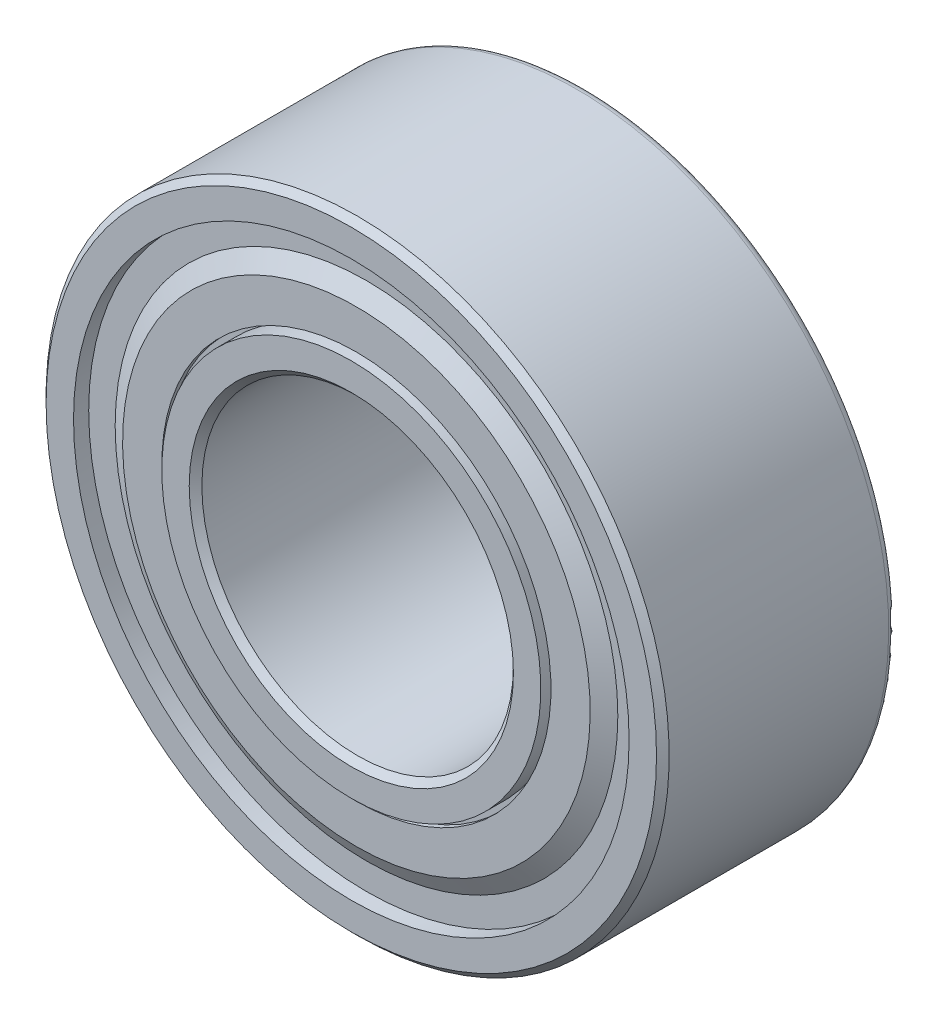
ISO-10303-21;
HEADER;
FILE_DESCRIPTION(('STEP AP214'),'2;1');
FILE_NAME('part.step','',(''),(''),'','','');
FILE_SCHEMA(('AUTOMOTIVE_DESIGN { 1 0 10303 214 1 1 1 1 }'));
ENDSEC;
DATA;
#1=APPLICATION_CONTEXT('core data for automotive mechanical design processes');
#2=APPLICATION_PROTOCOL_DEFINITION('international standard','automotive_design',2000,#1);
#3=PRODUCT_CONTEXT('',#1,'mechanical');
#4=PRODUCT('Part','Part','',(#3));
#5=PRODUCT_RELATED_PRODUCT_CATEGORY('part','',(#4));
#6=PRODUCT_DEFINITION_FORMATION('','',#4);
#7=PRODUCT_DEFINITION_CONTEXT('part definition',#1,'design');
#8=PRODUCT_DEFINITION('design','',#6,#7);
#9=PRODUCT_DEFINITION_SHAPE('','',#8);
#10=(LENGTH_UNIT() NAMED_UNIT(*) SI_UNIT(.MILLI.,.METRE.));
#11=(NAMED_UNIT(*) PLANE_ANGLE_UNIT() SI_UNIT($,.RADIAN.));
#12=(NAMED_UNIT(*) SI_UNIT($,.STERADIAN.) SOLID_ANGLE_UNIT());
#13=UNCERTAINTY_MEASURE_WITH_UNIT(LENGTH_MEASURE(1.E-05),#10,'distance_accuracy_value','');
#14=(GEOMETRIC_REPRESENTATION_CONTEXT(3) GLOBAL_UNCERTAINTY_ASSIGNED_CONTEXT((#13)) GLOBAL_UNIT_ASSIGNED_CONTEXT((#10,
#11,#12)) REPRESENTATION_CONTEXT('',''));
#15=CARTESIAN_POINT('',(0.,0.,0.));
#16=DIRECTION('',(0.,0.,1.));
#17=DIRECTION('',(1.,0.,0.));
#18=AXIS2_PLACEMENT_3D('',#15,#16,#17);
#19=CARTESIAN_POINT('',(0.,0.,0.));
#20=DIRECTION('',(0.,0.,1.));
#21=DIRECTION('',(0.,-1.,0.));
#22=AXIS2_PLACEMENT_3D('',#19,#20,#21);
#23=CYLINDRICAL_SURFACE('',#22,3.56666666666667);
#24=CARTESIAN_POINT('',(0.,0.,-1.24));
#25=DIRECTION('',(0.,0.,1.));
#26=DIRECTION('',(0.,-1.,0.));
#27=AXIS2_PLACEMENT_3D('',#24,#25,#26);
#28=CIRCLE('',#27,3.56666666666667);
#29=CARTESIAN_POINT('',(0.,-3.56666666666667,-1.24));
#30=VERTEX_POINT('',#29);
#31=EDGE_CURVE('E83',#30,#30,#28,.T.);
#32=ORIENTED_EDGE('',*,*,#31,.F.);
#33=EDGE_LOOP('',(#32));
#34=FACE_BOUND('',#33,.T.);
#35=CARTESIAN_POINT('',(0.,0.,-1.305));
#36=DIRECTION('',(0.,0.,1.));
#37=DIRECTION('',(0.,-1.,0.));
#38=AXIS2_PLACEMENT_3D('',#35,#36,#37);
#39=CIRCLE('',#38,3.56666666666667);
#40=CARTESIAN_POINT('',(0.,-3.56666666666667,-1.305));
#41=VERTEX_POINT('',#40);
#42=EDGE_CURVE('E12',#41,#41,#39,.T.);
#43=ORIENTED_EDGE('',*,*,#42,.T.);
#44=EDGE_LOOP('',(#43));
#45=FACE_BOUND('',#44,.T.);
#46=ADVANCED_FACE('F55',(#34,#45),#23,.T.);
#47=CARTESIAN_POINT('',(0.,3.56666666666667,-1.305));
#48=DIRECTION('',(0.,0.,1.));
#49=DIRECTION('',(0.,-1.,0.));
#50=AXIS2_PLACEMENT_3D('',#47,#48,#49);
#51=PLANE('',#50);
#52=ORIENTED_EDGE('',*,*,#42,.F.);
#53=EDGE_LOOP('',(#52));
#54=FACE_BOUND('',#53,.T.);
#55=CARTESIAN_POINT('',(0.,0.,-1.305));
#56=DIRECTION('',(0.,0.,1.));
#57=DIRECTION('',(0.,-1.,0.));
#58=AXIS2_PLACEMENT_3D('',#55,#56,#57);
#59=CIRCLE('',#58,3.22694050703183);
#60=CARTESIAN_POINT('',(0.,-3.22694050703183,-1.305));
#61=VERTEX_POINT('',#60);
#62=EDGE_CURVE('E61',#61,#61,#59,.T.);
#63=ORIENTED_EDGE('',*,*,#62,.T.);
#64=EDGE_LOOP('',(#63));
#65=FACE_BOUND('',#64,.T.);
#66=ADVANCED_FACE('F90',(#54,#65),#51,.F.);
#67=CARTESIAN_POINT('',(0.,0.,-1.435));
#68=DIRECTION('',(0.,0.,1.));
#69=DIRECTION('',(0.,-1.,0.));
#70=AXIS2_PLACEMENT_3D('',#67,#68,#69);
#71=CONICAL_SURFACE('',#70,3.00177390204788,1.0471975511966);
#72=ORIENTED_EDGE('',*,*,#62,.F.);
#73=EDGE_LOOP('',(#72));
#74=FACE_BOUND('',#73,.T.);
#75=CARTESIAN_POINT('',(0.,0.,-1.435));
#76=DIRECTION('',(0.,0.,1.));
#77=DIRECTION('',(0.,-1.,0.));
#78=AXIS2_PLACEMENT_3D('',#75,#76,#77);
#79=CIRCLE('',#78,3.00177390204788);
#80=CARTESIAN_POINT('',(0.,-3.00177390204788,-1.435));
#81=VERTEX_POINT('',#80);
#82=EDGE_CURVE('E65',#81,#81,#79,.T.);
#83=ORIENTED_EDGE('',*,*,#82,.T.);
#84=EDGE_LOOP('',(#83));
#85=FACE_BOUND('',#84,.T.);
#86=ADVANCED_FACE('F94',(#74,#85),#71,.T.);
#87=CARTESIAN_POINT('',(0.,3.00177390204788,-1.435));
#88=DIRECTION('',(0.,0.,1.));
#89=DIRECTION('',(0.,-1.,0.));
#90=AXIS2_PLACEMENT_3D('',#87,#88,#89);
#91=PLANE('',#90);
#92=ORIENTED_EDGE('',*,*,#82,.F.);
#93=EDGE_LOOP('',(#92));
#94=FACE_BOUND('',#93,.T.);
#95=CARTESIAN_POINT('',(0.,0.,-1.435));
#96=DIRECTION('',(0.,0.,1.));
#97=DIRECTION('',(0.,-1.,0.));
#98=AXIS2_PLACEMENT_3D('',#95,#96,#97);
#99=CIRCLE('',#98,2.49833333333333);
#100=CARTESIAN_POINT('',(0.,-2.49833333333333,-1.435));
#101=VERTEX_POINT('',#100);
#102=EDGE_CURVE('E69',#101,#101,#99,.T.);
#103=ORIENTED_EDGE('',*,*,#102,.T.);
#104=EDGE_LOOP('',(#103));
#105=FACE_BOUND('',#104,.T.);
#106=ADVANCED_FACE('F99',(#94,#105),#91,.F.);
#107=CARTESIAN_POINT('',(0.,0.,0.));
#108=DIRECTION('',(0.,0.,1.));
#109=DIRECTION('',(0.,-1.,0.));
#110=AXIS2_PLACEMENT_3D('',#107,#108,#109);
#111=CYLINDRICAL_SURFACE('',#110,2.49833333333333);
#112=ORIENTED_EDGE('',*,*,#102,.F.);
#113=EDGE_LOOP('',(#112));
#114=FACE_BOUND('',#113,.T.);
#115=CARTESIAN_POINT('',(0.,0.,-1.37));
#116=DIRECTION('',(0.,0.,1.));
#117=DIRECTION('',(0.,-1.,0.));
#118=AXIS2_PLACEMENT_3D('',#115,#116,#117);
#119=CIRCLE('',#118,2.49833333333333);
#120=CARTESIAN_POINT('',(0.,-2.49833333333333,-1.37));
#121=VERTEX_POINT('',#120);
#122=EDGE_CURVE('E74',#121,#121,#119,.T.);
#123=ORIENTED_EDGE('',*,*,#122,.T.);
#124=EDGE_LOOP('',(#123));
#125=FACE_BOUND('',#124,.T.);
#126=ADVANCED_FACE('F105',(#114,#125),#111,.F.);
#127=CARTESIAN_POINT('',(0.,2.98435720453986,-1.37));
#128=DIRECTION('',(0.,0.,-1.));
#129=DIRECTION('',(0.,1.,0.));
#130=AXIS2_PLACEMENT_3D('',#127,#128,#129);
#131=PLANE('',#130);
#132=ORIENTED_EDGE('',*,*,#122,.F.);
#133=EDGE_LOOP('',(#132));
#134=FACE_BOUND('',#133,.T.);
#135=CARTESIAN_POINT('',(0.,0.,-1.37));
#136=DIRECTION('',(0.,0.,1.));
#137=DIRECTION('',(0.,-1.,0.));
#138=AXIS2_PLACEMENT_3D('',#135,#136,#137);
#139=CIRCLE('',#138,2.98435720453986);
#140=CARTESIAN_POINT('',(0.,-2.98435720453986,-1.37));
#141=VERTEX_POINT('',#140);
#142=EDGE_CURVE('E77',#141,#141,#139,.T.);
#143=ORIENTED_EDGE('',*,*,#142,.T.);
#144=EDGE_LOOP('',(#143));
#145=FACE_BOUND('',#144,.T.);
#146=ADVANCED_FACE('F109',(#134,#145),#131,.F.);
#147=CARTESIAN_POINT('',(0.,0.,-1.24));
#148=DIRECTION('',(0.,0.,1.));
#149=DIRECTION('',(0.,-1.,0.));
#150=AXIS2_PLACEMENT_3D('',#147,#148,#149);
#151=CONICAL_SURFACE('',#150,3.20952380952381,1.0471975511966);
#152=ORIENTED_EDGE('',*,*,#142,.F.);
#153=EDGE_LOOP('',(#152));
#154=FACE_BOUND('',#153,.T.);
#155=CARTESIAN_POINT('',(0.,0.,-1.24));
#156=DIRECTION('',(0.,0.,1.));
#157=DIRECTION('',(0.,-1.,0.));
#158=AXIS2_PLACEMENT_3D('',#155,#156,#157);
#159=CIRCLE('',#158,3.20952380952381);
#160=CARTESIAN_POINT('',(0.,-3.20952380952381,-1.24));
#161=VERTEX_POINT('',#160);
#162=EDGE_CURVE('E80',#161,#161,#159,.T.);
#163=ORIENTED_EDGE('',*,*,#162,.T.);
#164=EDGE_LOOP('',(#163));
#165=FACE_BOUND('',#164,.T.);
#166=ADVANCED_FACE('F113',(#154,#165),#151,.F.);
#167=CARTESIAN_POINT('',(0.,3.56666666666667,-1.24));
#168=DIRECTION('',(0.,0.,-1.));
#169=DIRECTION('',(0.,1.,0.));
#170=AXIS2_PLACEMENT_3D('',#167,#168,#169);
#171=PLANE('',#170);
#172=ORIENTED_EDGE('',*,*,#162,.F.);
#173=EDGE_LOOP('',(#172));
#174=FACE_BOUND('',#173,.T.);
#175=ORIENTED_EDGE('',*,*,#31,.T.);
#176=EDGE_LOOP('',(#175));
#177=FACE_BOUND('',#176,.T.);
#178=ADVANCED_FACE('F87',(#174,#177),#171,.F.);
#179=CLOSED_SHELL('',(#46,#66,#86,#106,#126,#146,#166,#178));
#180=MANIFOLD_SOLID_BREP('B2',#179);
#181=CARTESIAN_POINT('',(0.,0.,0.));
#182=DIRECTION('',(0.,0.,1.));
#183=DIRECTION('',(0.,-1.,0.));
#184=AXIS2_PLACEMENT_3D('',#181,#182,#183);
#185=CYLINDRICAL_SURFACE('',#184,3.56666666666667);
#186=CARTESIAN_POINT('',(0.,0.,1.305));
#187=DIRECTION('',(0.,0.,1.));
#188=DIRECTION('',(0.,-1.,0.));
#189=AXIS2_PLACEMENT_3D('',#186,#187,#188);
#190=CIRCLE('',#189,3.56666666666667);
#191=CARTESIAN_POINT('',(0.,-3.56666666666667,1.305));
#192=VERTEX_POINT('',#191);
#193=EDGE_CURVE('E54',#192,#192,#190,.T.);
#194=ORIENTED_EDGE('',*,*,#193,.F.);
#195=EDGE_LOOP('',(#194));
#196=FACE_BOUND('',#195,.T.);
#197=CARTESIAN_POINT('',(0.,0.,1.24));
#198=DIRECTION('',(0.,0.,1.));
#199=DIRECTION('',(0.,-1.,0.));
#200=AXIS2_PLACEMENT_3D('',#197,#198,#199);
#201=CIRCLE('',#200,3.56666666666667);
#202=CARTESIAN_POINT('',(0.,-3.56666666666667,1.24));
#203=VERTEX_POINT('',#202);
#204=EDGE_CURVE('E210',#203,#203,#201,.T.);
#205=ORIENTED_EDGE('',*,*,#204,.T.);
#206=EDGE_LOOP('',(#205));
#207=FACE_BOUND('',#206,.T.);
#208=ADVANCED_FACE('F182',(#196,#207),#185,.T.);
#209=CARTESIAN_POINT('',(0.,3.56666666666667,1.305));
#210=DIRECTION('',(0.,0.,-1.));
#211=DIRECTION('',(0.,1.,0.));
#212=AXIS2_PLACEMENT_3D('',#209,#210,#211);
#213=PLANE('',#212);
#214=CARTESIAN_POINT('',(0.,0.,1.305));
#215=DIRECTION('',(0.,0.,1.));
#216=DIRECTION('',(0.,-1.,0.));
#217=AXIS2_PLACEMENT_3D('',#214,#215,#216);
#218=CIRCLE('',#217,3.22694050703183);
#219=CARTESIAN_POINT('',(0.,-3.22694050703183,1.305));
#220=VERTEX_POINT('',#219);
#221=EDGE_CURVE('E188',#220,#220,#218,.T.);
#222=ORIENTED_EDGE('',*,*,#221,.F.);
#223=EDGE_LOOP('',(#222));
#224=FACE_BOUND('',#223,.T.);
#225=ORIENTED_EDGE('',*,*,#193,.T.);
#226=EDGE_LOOP('',(#225));
#227=FACE_BOUND('',#226,.T.);
#228=ADVANCED_FACE('F247',(#224,#227),#213,.F.);
#229=CARTESIAN_POINT('',(0.,0.,1.305));
#230=DIRECTION('',(0.,0.,-1.));
#231=DIRECTION('',(0.,1.,0.));
#232=AXIS2_PLACEMENT_3D('',#229,#230,#231);
#233=CONICAL_SURFACE('',#232,3.22694050703183,1.0471975511966);
#234=CARTESIAN_POINT('',(0.,0.,1.435));
#235=DIRECTION('',(0.,0.,1.));
#236=DIRECTION('',(0.,-1.,0.));
#237=AXIS2_PLACEMENT_3D('',#234,#235,#236);
#238=CIRCLE('',#237,3.00177390204788);
#239=CARTESIAN_POINT('',(0.,-3.00177390204788,1.435));
#240=VERTEX_POINT('',#239);
#241=EDGE_CURVE('E192',#240,#240,#238,.T.);
#242=ORIENTED_EDGE('',*,*,#241,.F.);
#243=EDGE_LOOP('',(#242));
#244=FACE_BOUND('',#243,.T.);
#245=ORIENTED_EDGE('',*,*,#221,.T.);
#246=EDGE_LOOP('',(#245));
#247=FACE_BOUND('',#246,.T.);
#248=ADVANCED_FACE('F242',(#244,#247),#233,.T.);
#249=CARTESIAN_POINT('',(0.,3.00177390204788,1.435));
#250=DIRECTION('',(0.,0.,-1.));
#251=DIRECTION('',(0.,1.,0.));
#252=AXIS2_PLACEMENT_3D('',#249,#250,#251);
#253=PLANE('',#252);
#254=CARTESIAN_POINT('',(0.,0.,1.435));
#255=DIRECTION('',(0.,0.,1.));
#256=DIRECTION('',(0.,-1.,0.));
#257=AXIS2_PLACEMENT_3D('',#254,#255,#256);
#258=CIRCLE('',#257,2.49833333333333);
#259=CARTESIAN_POINT('',(0.,-2.49833333333333,1.435));
#260=VERTEX_POINT('',#259);
#261=EDGE_CURVE('E196',#260,#260,#258,.T.);
#262=ORIENTED_EDGE('',*,*,#261,.F.);
#263=EDGE_LOOP('',(#262));
#264=FACE_BOUND('',#263,.T.);
#265=ORIENTED_EDGE('',*,*,#241,.T.);
#266=EDGE_LOOP('',(#265));
#267=FACE_BOUND('',#266,.T.);
#268=ADVANCED_FACE('F236',(#264,#267),#253,.F.);
#269=CARTESIAN_POINT('',(0.,0.,0.));
#270=DIRECTION('',(0.,0.,1.));
#271=DIRECTION('',(0.,-1.,0.));
#272=AXIS2_PLACEMENT_3D('',#269,#270,#271);
#273=CYLINDRICAL_SURFACE('',#272,2.49833333333333);
#274=CARTESIAN_POINT('',(0.,0.,1.37));
#275=DIRECTION('',(0.,0.,1.));
#276=DIRECTION('',(0.,-1.,0.));
#277=AXIS2_PLACEMENT_3D('',#274,#275,#276);
#278=CIRCLE('',#277,2.49833333333333);
#279=CARTESIAN_POINT('',(0.,-2.49833333333333,1.37));
#280=VERTEX_POINT('',#279);
#281=EDGE_CURVE('E201',#280,#280,#278,.T.);
#282=ORIENTED_EDGE('',*,*,#281,.F.);
#283=EDGE_LOOP('',(#282));
#284=FACE_BOUND('',#283,.T.);
#285=ORIENTED_EDGE('',*,*,#261,.T.);
#286=EDGE_LOOP('',(#285));
#287=FACE_BOUND('',#286,.T.);
#288=ADVANCED_FACE('F230',(#284,#287),#273,.F.);
#289=CARTESIAN_POINT('',(0.,2.98435720453986,1.37));
#290=DIRECTION('',(0.,0.,1.));
#291=DIRECTION('',(0.,-1.,0.));
#292=AXIS2_PLACEMENT_3D('',#289,#290,#291);
#293=PLANE('',#292);
#294=CARTESIAN_POINT('',(0.,0.,1.37));
#295=DIRECTION('',(0.,0.,1.));
#296=DIRECTION('',(0.,-1.,0.));
#297=AXIS2_PLACEMENT_3D('',#294,#295,#296);
#298=CIRCLE('',#297,2.98435720453986);
#299=CARTESIAN_POINT('',(0.,-2.98435720453986,1.37));
#300=VERTEX_POINT('',#299);
#301=EDGE_CURVE('E204',#300,#300,#298,.T.);
#302=ORIENTED_EDGE('',*,*,#301,.F.);
#303=EDGE_LOOP('',(#302));
#304=FACE_BOUND('',#303,.T.);
#305=ORIENTED_EDGE('',*,*,#281,.T.);
#306=EDGE_LOOP('',(#305));
#307=FACE_BOUND('',#306,.T.);
#308=ADVANCED_FACE('F224',(#304,#307),#293,.F.);
#309=CARTESIAN_POINT('',(0.,0.,1.37));
#310=DIRECTION('',(0.,0.,-1.));
#311=DIRECTION('',(0.,1.,0.));
#312=AXIS2_PLACEMENT_3D('',#309,#310,#311);
#313=CONICAL_SURFACE('',#312,2.98435720453986,1.0471975511966);
#314=CARTESIAN_POINT('',(0.,0.,1.24));
#315=DIRECTION('',(0.,0.,1.));
#316=DIRECTION('',(0.,-1.,0.));
#317=AXIS2_PLACEMENT_3D('',#314,#315,#316);
#318=CIRCLE('',#317,3.20952380952381);
#319=CARTESIAN_POINT('',(0.,-3.20952380952381,1.24));
#320=VERTEX_POINT('',#319);
#321=EDGE_CURVE('E207',#320,#320,#318,.T.);
#322=ORIENTED_EDGE('',*,*,#321,.F.);
#323=EDGE_LOOP('',(#322));
#324=FACE_BOUND('',#323,.T.);
#325=ORIENTED_EDGE('',*,*,#301,.T.);
#326=EDGE_LOOP('',(#325));
#327=FACE_BOUND('',#326,.T.);
#328=ADVANCED_FACE('F218',(#324,#327),#313,.F.);
#329=CARTESIAN_POINT('',(0.,3.56666666666667,1.24));
#330=DIRECTION('',(0.,0.,1.));
#331=DIRECTION('',(0.,-1.,0.));
#332=AXIS2_PLACEMENT_3D('',#329,#330,#331);
#333=PLANE('',#332);
#334=ORIENTED_EDGE('',*,*,#204,.F.);
#335=EDGE_LOOP('',(#334));
#336=FACE_BOUND('',#335,.T.);
#337=ORIENTED_EDGE('',*,*,#321,.T.);
#338=EDGE_LOOP('',(#337));
#339=FACE_BOUND('',#338,.T.);
#340=ADVANCED_FACE('F215',(#336,#339),#333,.F.);
#341=CLOSED_SHELL('',(#208,#228,#248,#268,#288,#308,#328,#340));
#342=MANIFOLD_SOLID_BREP('B7',#341);
#343=CARTESIAN_POINT('',(-1.49999999999997,2.59807621135334,0.));
#344=DIRECTION('',(-0.499999999999989,0.866025403784445,0.));
#345=DIRECTION('',(0.866025403784445,0.499999999999989,0.));
#346=AXIS2_PLACEMENT_3D('',#343,#344,#345);
#347=SPHERICAL_SURFACE('',#346,0.6);
#348=CARTESIAN_POINT('',(-1.79999999999996,3.117691453624,0.));
#349=VERTEX_POINT('',#348);
#350=VERTEX_LOOP('',#349);
#351=FACE_BOUND('',#350,.T.);
#352=ADVANCED_FACE('F309',(#351),#347,.T.);
#353=CLOSED_SHELL('',(#352));
#354=MANIFOLD_SOLID_BREP('B49',#353);
#355=CARTESIAN_POINT('',(-2.5980762113533,1.50000000000003,0.));
#356=DIRECTION('',(-0.866025403784433,0.50000000000001,0.));
#357=DIRECTION('',(0.50000000000001,0.866025403784433,0.));
#358=AXIS2_PLACEMENT_3D('',#355,#356,#357);
#359=SPHERICAL_SURFACE('',#358,0.6);
#360=CARTESIAN_POINT('',(-3.11769145362396,1.80000000000004,0.));
#361=VERTEX_POINT('',#360);
#362=VERTEX_LOOP('',#361);
#363=FACE_BOUND('',#362,.T.);
#364=ADVANCED_FACE('F327',(#363),#359,.T.);
#365=CLOSED_SHELL('',(#364));
#366=MANIFOLD_SOLID_BREP('B178',#365);
#367=CARTESIAN_POINT('',(-3.,0.,0.));
#368=DIRECTION('',(-1.,0.,0.));
#369=DIRECTION('',(0.,1.,0.));
#370=AXIS2_PLACEMENT_3D('',#367,#368,#369);
#371=SPHERICAL_SURFACE('',#370,0.6);
#372=CARTESIAN_POINT('',(-3.6,0.,0.));
#373=VERTEX_POINT('',#372);
#374=VERTEX_LOOP('',#373);
#375=FACE_BOUND('',#374,.T.);
#376=ADVANCED_FACE('F345',(#375),#371,.T.);
#377=CLOSED_SHELL('',(#376));
#378=MANIFOLD_SOLID_BREP('B305',#377);
#379=CARTESIAN_POINT('',(-2.59807621135333,-1.49999999999998,0.));
#380=DIRECTION('',(-0.866025403784443,-0.499999999999992,0.));
#381=DIRECTION('',(-0.499999999999992,0.866025403784443,0.));
#382=AXIS2_PLACEMENT_3D('',#379,#380,#381);
#383=SPHERICAL_SURFACE('',#382,0.6);
#384=CARTESIAN_POINT('',(-3.117691453624,-1.79999999999997,0.));
#385=VERTEX_POINT('',#384);
#386=VERTEX_LOOP('',#385);
#387=FACE_BOUND('',#386,.T.);
#388=ADVANCED_FACE('F363',(#387),#383,.T.);
#389=CLOSED_SHELL('',(#388));
#390=MANIFOLD_SOLID_BREP('B323',#389);
#391=CARTESIAN_POINT('',(-1.50000000000002,-2.5980762113533,0.));
#392=DIRECTION('',(-0.500000000000007,-0.866025403784435,0.));
#393=DIRECTION('',(-0.866025403784435,0.500000000000007,0.));
#394=AXIS2_PLACEMENT_3D('',#391,#392,#393);
#395=SPHERICAL_SURFACE('',#394,0.6);
#396=CARTESIAN_POINT('',(-1.80000000000003,-3.11769145362396,0.));
#397=VERTEX_POINT('',#396);
#398=VERTEX_LOOP('',#397);
#399=FACE_BOUND('',#398,.T.);
#400=ADVANCED_FACE('F381',(#399),#395,.T.);
#401=CLOSED_SHELL('',(#400));
#402=MANIFOLD_SOLID_BREP('B341',#401);
#403=CARTESIAN_POINT('',(0.,-3.,0.));
#404=DIRECTION('',(0.,-1.,0.));
#405=DIRECTION('',(-1.,0.,0.));
#406=AXIS2_PLACEMENT_3D('',#403,#404,#405);
#407=SPHERICAL_SURFACE('',#406,0.6);
#408=CARTESIAN_POINT('',(0.,-3.6,0.));
#409=VERTEX_POINT('',#408);
#410=VERTEX_LOOP('',#409);
#411=FACE_BOUND('',#410,.T.);
#412=ADVANCED_FACE('F399',(#411),#407,.T.);
#413=CLOSED_SHELL('',(#412));
#414=MANIFOLD_SOLID_BREP('B359',#413);
#415=CARTESIAN_POINT('',(1.49999999999998,-2.59807621135332,0.));
#416=DIRECTION('',(0.499999999999995,-0.866025403784442,0.));
#417=DIRECTION('',(-0.866025403784442,-0.499999999999995,0.));
#418=AXIS2_PLACEMENT_3D('',#415,#416,#417);
#419=SPHERICAL_SURFACE('',#418,0.6);
#420=CARTESIAN_POINT('',(1.79999999999998,-3.11769145362399,0.));
#421=VERTEX_POINT('',#420);
#422=VERTEX_LOOP('',#421);
#423=FACE_BOUND('',#422,.T.);
#424=ADVANCED_FACE('F417',(#423),#419,.T.);
#425=CLOSED_SHELL('',(#424));
#426=MANIFOLD_SOLID_BREP('B377',#425);
#427=CARTESIAN_POINT('',(2.59807621135331,-1.50000000000001,0.));
#428=DIRECTION('',(0.866025403784436,-0.500000000000004,0.));
#429=DIRECTION('',(-0.500000000000004,-0.866025403784436,0.));
#430=AXIS2_PLACEMENT_3D('',#427,#428,#429);
#431=SPHERICAL_SURFACE('',#430,0.6);
#432=CARTESIAN_POINT('',(3.11769145362397,-1.80000000000001,0.));
#433=VERTEX_POINT('',#432);
#434=VERTEX_LOOP('',#433);
#435=FACE_BOUND('',#434,.T.);
#436=ADVANCED_FACE('F435',(#435),#431,.T.);
#437=CLOSED_SHELL('',(#436));
#438=MANIFOLD_SOLID_BREP('B395',#437);
#439=CARTESIAN_POINT('',(3.,0.,0.));
#440=DIRECTION('',(1.,0.,0.));
#441=DIRECTION('',(0.,-1.,0.));
#442=AXIS2_PLACEMENT_3D('',#439,#440,#441);
#443=SPHERICAL_SURFACE('',#442,0.6);
#444=CARTESIAN_POINT('',(3.6,0.,0.));
#445=VERTEX_POINT('',#444);
#446=VERTEX_LOOP('',#445);
#447=FACE_BOUND('',#446,.T.);
#448=ADVANCED_FACE('F453',(#447),#443,.T.);
#449=CLOSED_SHELL('',(#448));
#450=MANIFOLD_SOLID_BREP('B413',#449);
#451=CARTESIAN_POINT('',(2.59807621135332,1.49999999999999,0.));
#452=DIRECTION('',(0.86602540378444,0.499999999999998,0.));
#453=DIRECTION('',(0.499999999999998,-0.86602540378444,0.));
#454=AXIS2_PLACEMENT_3D('',#451,#452,#453);
#455=SPHERICAL_SURFACE('',#454,0.6);
#456=CARTESIAN_POINT('',(3.11769145362398,1.79999999999999,0.));
#457=VERTEX_POINT('',#456);
#458=VERTEX_LOOP('',#457);
#459=FACE_BOUND('',#458,.T.);
#460=ADVANCED_FACE('F471',(#459),#455,.T.);
#461=CLOSED_SHELL('',(#460));
#462=MANIFOLD_SOLID_BREP('B431',#461);
#463=CARTESIAN_POINT('',(1.5,2.59807621135331,0.));
#464=DIRECTION('',(0.500000000000001,0.866025403784438,0.));
#465=DIRECTION('',(0.866025403784438,-0.500000000000001,0.));
#466=AXIS2_PLACEMENT_3D('',#463,#464,#465);
#467=SPHERICAL_SURFACE('',#466,0.6);
#468=CARTESIAN_POINT('',(1.8,3.11769145362398,0.));
#469=VERTEX_POINT('',#468);
#470=VERTEX_LOOP('',#469);
#471=FACE_BOUND('',#470,.T.);
#472=ADVANCED_FACE('F489',(#471),#467,.T.);
#473=CLOSED_SHELL('',(#472));
#474=MANIFOLD_SOLID_BREP('B449',#473);
#475=CARTESIAN_POINT('',(0.,3.,0.));
#476=DIRECTION('',(0.,1.,0.));
#477=DIRECTION('',(1.,0.,0.));
#478=AXIS2_PLACEMENT_3D('',#475,#476,#477);
#479=SPHERICAL_SURFACE('',#478,0.6);
#480=CARTESIAN_POINT('',(0.,3.6,0.));
#481=VERTEX_POINT('',#480);
#482=VERTEX_LOOP('',#481);
#483=FACE_BOUND('',#482,.T.);
#484=ADVANCED_FACE('F509',(#483),#479,.T.);
#485=CLOSED_SHELL('',(#484));
#486=MANIFOLD_SOLID_BREP('B467',#485);
#487=CARTESIAN_POINT('',(0.,0.,-1.4));
#488=DIRECTION('',(0.,0.,1.));
#489=DIRECTION('',(0.,-1.,0.));
#490=AXIS2_PLACEMENT_3D('',#487,#488,#489);
#491=TOROIDAL_SURFACE('',#490,3.9,0.1);
#492=CARTESIAN_POINT('',(0.,0.,-1.4));
#493=DIRECTION('',(0.,0.,1.));
#494=DIRECTION('',(0.,-1.,0.));
#495=AXIS2_PLACEMENT_3D('',#492,#493,#494);
#496=CIRCLE('',#495,4.);
#497=CARTESIAN_POINT('',(0.,-4.,-1.4));
#498=VERTEX_POINT('',#497);
#499=EDGE_CURVE('E529',#498,#498,#496,.T.);
#500=ORIENTED_EDGE('',*,*,#499,.F.);
#501=EDGE_LOOP('',(#500));
#502=FACE_BOUND('',#501,.T.);
#503=CARTESIAN_POINT('',(0.,0.,-1.5));
#504=DIRECTION('',(0.,0.,1.));
#505=DIRECTION('',(0.,-1.,0.));
#506=AXIS2_PLACEMENT_3D('',#503,#504,#505);
#507=CIRCLE('',#506,3.9);
#508=CARTESIAN_POINT('',(0.,-3.9,-1.5));
#509=VERTEX_POINT('',#508);
#510=EDGE_CURVE('E508',#509,#509,#507,.F.);
#511=ORIENTED_EDGE('',*,*,#510,.F.);
#512=EDGE_LOOP('',(#511));
#513=FACE_BOUND('',#512,.T.);
#514=ADVANCED_FACE('F522',(#502,#513),#491,.T.);
#515=CARTESIAN_POINT('',(0.,0.,-0.634834957055046));
#516=DIRECTION('',(0.,0.,1.));
#517=DIRECTION('',(0.,-1.,0.));
#518=AXIS2_PLACEMENT_3D('',#515,#516,#517);
#519=PLANE('',#518);
#520=CARTESIAN_POINT('',(0.,0.,-0.634834957055046));
#521=DIRECTION('',(0.,0.,1.));
#522=DIRECTION('',(0.,-1.,0.));
#523=AXIS2_PLACEMENT_3D('',#520,#521,#522);
#524=CIRCLE('',#523,2.65);
#525=CARTESIAN_POINT('',(0.,-2.65,-0.634834957055046));
#526=VERTEX_POINT('',#525);
#527=EDGE_CURVE('E595',#526,#526,#524,.T.);
#528=ORIENTED_EDGE('',*,*,#527,.F.);
#529=EDGE_LOOP('',(#528));
#530=FACE_BOUND('',#529,.T.);
#531=CARTESIAN_POINT('',(0.,0.,-0.634834957055046));
#532=DIRECTION('',(0.,0.,1.));
#533=DIRECTION('',(0.,-1.,0.));
#534=AXIS2_PLACEMENT_3D('',#531,#532,#533);
#535=CIRCLE('',#534,3.35);
#536=CARTESIAN_POINT('',(0.,-3.35,-0.634834957055046));
#537=VERTEX_POINT('',#536);
#538=EDGE_CURVE('E542',#537,#537,#535,.T.);
#539=ORIENTED_EDGE('',*,*,#538,.T.);
#540=EDGE_LOOP('',(#539));
#541=FACE_BOUND('',#540,.T.);
#542=ADVANCED_FACE('F666',(#530,#541),#519,.T.);
#543=CARTESIAN_POINT('',(0.,0.,0.));
#544=DIRECTION('',(0.,0.,1.));
#545=DIRECTION('',(0.,-1.,0.));
#546=AXIS2_PLACEMENT_3D('',#543,#544,#545);
#547=CYLINDRICAL_SURFACE('',#546,2.65);
#548=CARTESIAN_POINT('',(0.,0.,0.487339717240448));
#549=DIRECTION('',(0.,0.,1.));
#550=DIRECTION('',(0.,-1.,0.));
#551=AXIS2_PLACEMENT_3D('',#548,#549,#550);
#552=CIRCLE('',#551,2.65);
#553=CARTESIAN_POINT('',(0.,-2.65,0.487339717240448));
#554=VERTEX_POINT('',#553);
#555=EDGE_CURVE('E563',#554,#554,#552,.T.);
#556=ORIENTED_EDGE('',*,*,#555,.T.);
#557=EDGE_LOOP('',(#556));
#558=FACE_BOUND('',#557,.T.);
#559=CARTESIAN_POINT('',(0.,0.,1.24));
#560=DIRECTION('',(0.,0.,1.));
#561=DIRECTION('',(0.,-1.,0.));
#562=AXIS2_PLACEMENT_3D('',#559,#560,#561);
#563=CIRCLE('',#562,2.65);
#564=CARTESIAN_POINT('',(0.,-2.65,1.24));
#565=VERTEX_POINT('',#564);
#566=EDGE_CURVE('E587',#565,#565,#563,.T.);
#567=ORIENTED_EDGE('',*,*,#566,.F.);
#568=EDGE_LOOP('',(#567));
#569=FACE_BOUND('',#568,.T.);
#570=ADVANCED_FACE('F672',(#558,#569),#547,.T.);
#571=CARTESIAN_POINT('',(0.,2.,1.5));
#572=DIRECTION('',(0.,0.,-1.));
#573=DIRECTION('',(0.,1.,0.));
#574=AXIS2_PLACEMENT_3D('',#571,#572,#573);
#575=PLANE('',#574);
#576=CARTESIAN_POINT('',(0.,0.,1.5));
#577=DIRECTION('',(0.,0.,-1.));
#578=DIRECTION('',(0.,1.,0.));
#579=AXIS2_PLACEMENT_3D('',#576,#577,#578);
#580=CIRCLE('',#579,2.08125);
#581=CARTESIAN_POINT('',(0.,2.08125,1.5));
#582=VERTEX_POINT('',#581);
#583=EDGE_CURVE('E534',#582,#582,#580,.T.);
#584=ORIENTED_EDGE('',*,*,#583,.T.);
#585=EDGE_LOOP('',(#584));
#586=FACE_BOUND('',#585,.T.);
#587=CARTESIAN_POINT('',(0.,0.,1.5));
#588=DIRECTION('',(0.,0.,1.));
#589=DIRECTION('',(0.,-1.,0.));
#590=AXIS2_PLACEMENT_3D('',#587,#588,#589);
#591=CIRCLE('',#590,2.43333333333333);
#592=CARTESIAN_POINT('',(0.,-2.43333333333333,1.5));
#593=VERTEX_POINT('',#592);
#594=EDGE_CURVE('E579',#593,#593,#591,.T.);
#595=ORIENTED_EDGE('',*,*,#594,.T.);
#596=EDGE_LOOP('',(#595));
#597=FACE_BOUND('',#596,.T.);
#598=ADVANCED_FACE('F681',(#586,#597),#575,.F.);
#599=CARTESIAN_POINT('',(0.,0.,0.));
#600=DIRECTION('',(0.,0.,1.));
#601=DIRECTION('',(0.,-1.,0.));
#602=AXIS2_PLACEMENT_3D('',#599,#600,#601);
#603=CYLINDRICAL_SURFACE('',#602,2.65);
#604=ORIENTED_EDGE('',*,*,#527,.T.);
#605=EDGE_LOOP('',(#604));
#606=FACE_BOUND('',#605,.T.);
#607=CARTESIAN_POINT('',(0.,0.,-0.487339717240449));
#608=DIRECTION('',(0.,0.,1.));
#609=DIRECTION('',(0.,-1.,0.));
#610=AXIS2_PLACEMENT_3D('',#607,#608,#609);
#611=CIRCLE('',#610,2.65);
#612=CARTESIAN_POINT('',(0.,-2.65,-0.487339717240449));
#613=VERTEX_POINT('',#612);
#614=EDGE_CURVE('E559',#613,#613,#611,.T.);
#615=ORIENTED_EDGE('',*,*,#614,.F.);
#616=EDGE_LOOP('',(#615));
#617=FACE_BOUND('',#616,.T.);
#618=ADVANCED_FACE('F721',(#606,#617),#603,.T.);
#619=CARTESIAN_POINT('',(0.,0.,0.));
#620=DIRECTION('',(0.,0.,1.));
#621=DIRECTION('',(0.,-1.,0.));
#622=AXIS2_PLACEMENT_3D('',#619,#620,#621);
#623=TOROIDAL_SURFACE('',#622,3.,0.6);
#624=ORIENTED_EDGE('',*,*,#555,.F.);
#625=EDGE_LOOP('',(#624));
#626=FACE_BOUND('',#625,.T.);
#627=ORIENTED_EDGE('',*,*,#614,.T.);
#628=EDGE_LOOP('',(#627));
#629=FACE_BOUND('',#628,.T.);
#630=ADVANCED_FACE('F718',(#626,#629),#623,.F.);
#631=CARTESIAN_POINT('',(0.,0.,0.));
#632=DIRECTION('',(0.,0.,1.));
#633=DIRECTION('',(0.,-1.,0.));
#634=AXIS2_PLACEMENT_3D('',#631,#632,#633);
#635=CYLINDRICAL_SURFACE('',#634,2.);
#636=CARTESIAN_POINT('',(0.,0.,1.41875));
#637=DIRECTION('',(0.,0.,-1.));
#638=DIRECTION('',(0.,1.,0.));
#639=AXIS2_PLACEMENT_3D('',#636,#637,#638);
#640=CIRCLE('',#639,2.);
#641=CARTESIAN_POINT('',(0.,2.,1.41875));
#642=VERTEX_POINT('',#641);
#643=EDGE_CURVE('E551',#642,#642,#640,.F.);
#644=ORIENTED_EDGE('',*,*,#643,.T.);
#645=EDGE_LOOP('',(#644));
#646=FACE_BOUND('',#645,.T.);
#647=CARTESIAN_POINT('',(0.,0.,-1.41875));
#648=DIRECTION('',(0.,0.,1.));
#649=DIRECTION('',(0.,-1.,0.));
#650=AXIS2_PLACEMENT_3D('',#647,#648,#649);
#651=CIRCLE('',#650,2.);
#652=CARTESIAN_POINT('',(0.,-2.,-1.41875));
#653=VERTEX_POINT('',#652);
#654=EDGE_CURVE('E539',#653,#653,#651,.F.);
#655=ORIENTED_EDGE('',*,*,#654,.T.);
#656=EDGE_LOOP('',(#655));
#657=FACE_BOUND('',#656,.T.);
#658=ADVANCED_FACE('F716',(#646,#657),#635,.F.);
#659=CARTESIAN_POINT('',(0.,0.,1.41875));
#660=DIRECTION('',(0.,0.,1.));
#661=DIRECTION('',(0.,-1.,0.));
#662=AXIS2_PLACEMENT_3D('',#659,#660,#661);
#663=CONICAL_SURFACE('',#662,2.,0.78539816339745);
#664=ORIENTED_EDGE('',*,*,#583,.F.);
#665=EDGE_LOOP('',(#664));
#666=FACE_BOUND('',#665,.T.);
#667=ORIENTED_EDGE('',*,*,#643,.F.);
#668=EDGE_LOOP('',(#667));
#669=FACE_BOUND('',#668,.T.);
#670=ADVANCED_FACE('F701',(#666,#669),#663,.F.);
#671=CARTESIAN_POINT('',(0.,0.,0.));
#672=DIRECTION('',(0.,0.,1.));
#673=DIRECTION('',(0.,-1.,0.));
#674=AXIS2_PLACEMENT_3D('',#671,#672,#673);
#675=CYLINDRICAL_SURFACE('',#674,2.43333333333333);
#676=CARTESIAN_POINT('',(0.,0.,1.24));
#677=DIRECTION('',(0.,0.,1.));
#678=DIRECTION('',(0.,-1.,0.));
#679=AXIS2_PLACEMENT_3D('',#676,#677,#678);
#680=CIRCLE('',#679,2.43333333333333);
#681=CARTESIAN_POINT('',(0.,-2.43333333333333,1.24));
#682=VERTEX_POINT('',#681);
#683=EDGE_CURVE('E583',#682,#682,#680,.T.);
#684=ORIENTED_EDGE('',*,*,#683,.T.);
#685=EDGE_LOOP('',(#684));
#686=FACE_BOUND('',#685,.T.);
#687=ORIENTED_EDGE('',*,*,#594,.F.);
#688=EDGE_LOOP('',(#687));
#689=FACE_BOUND('',#688,.T.);
#690=ADVANCED_FACE('F697',(#686,#689),#675,.T.);
#691=CARTESIAN_POINT('',(0.,2.65,1.24));
#692=DIRECTION('',(0.,0.,1.));
#693=DIRECTION('',(0.,-1.,0.));
#694=AXIS2_PLACEMENT_3D('',#691,#692,#693);
#695=PLANE('',#694);
#696=ORIENTED_EDGE('',*,*,#566,.T.);
#697=EDGE_LOOP('',(#696));
#698=FACE_BOUND('',#697,.T.);
#699=ORIENTED_EDGE('',*,*,#683,.F.);
#700=EDGE_LOOP('',(#699));
#701=FACE_BOUND('',#700,.T.);
#702=ADVANCED_FACE('F693',(#698,#701),#695,.T.);
#703=CARTESIAN_POINT('',(0.,3.35,1.24));
#704=DIRECTION('',(0.,0.,1.));
#705=DIRECTION('',(0.,-1.,0.));
#706=AXIS2_PLACEMENT_3D('',#703,#704,#705);
#707=PLANE('',#706);
#708=CARTESIAN_POINT('',(0.,0.,1.24));
#709=DIRECTION('',(0.,0.,1.));
#710=DIRECTION('',(0.,-1.,0.));
#711=AXIS2_PLACEMENT_3D('',#708,#709,#710);
#712=CIRCLE('',#711,3.56666666666667);
#713=CARTESIAN_POINT('',(0.,-3.56666666666667,1.24));
#714=VERTEX_POINT('',#713);
#715=EDGE_CURVE('E621',#714,#714,#712,.T.);
#716=ORIENTED_EDGE('',*,*,#715,.T.);
#717=EDGE_LOOP('',(#716));
#718=FACE_BOUND('',#717,.T.);
#719=CARTESIAN_POINT('',(0.,0.,1.24));
#720=DIRECTION('',(0.,0.,1.));
#721=DIRECTION('',(0.,-1.,0.));
#722=AXIS2_PLACEMENT_3D('',#719,#720,#721);
#723=CIRCLE('',#722,3.35);
#724=CARTESIAN_POINT('',(0.,-3.35,1.24));
#725=VERTEX_POINT('',#724);
#726=EDGE_CURVE('E625',#725,#725,#723,.T.);
#727=ORIENTED_EDGE('',*,*,#726,.F.);
#728=EDGE_LOOP('',(#727));
#729=FACE_BOUND('',#728,.T.);
#730=ADVANCED_FACE('F696',(#718,#729),#707,.T.);
#731=CARTESIAN_POINT('',(0.,0.,0.));
#732=DIRECTION('',(0.,0.,1.));
#733=DIRECTION('',(0.,-1.,0.));
#734=AXIS2_PLACEMENT_3D('',#731,#732,#733);
#735=CYLINDRICAL_SURFACE('',#734,3.56666666666667);
#736=CARTESIAN_POINT('',(0.,0.,1.5));
#737=DIRECTION('',(0.,0.,1.));
#738=DIRECTION('',(0.,-1.,0.));
#739=AXIS2_PLACEMENT_3D('',#736,#737,#738);
#740=CIRCLE('',#739,3.56666666666667);
#741=CARTESIAN_POINT('',(0.,-3.56666666666667,1.5));
#742=VERTEX_POINT('',#741);
#743=EDGE_CURVE('E617',#742,#742,#740,.T.);
#744=ORIENTED_EDGE('',*,*,#743,.T.);
#745=EDGE_LOOP('',(#744));
#746=FACE_BOUND('',#745,.T.);
#747=ORIENTED_EDGE('',*,*,#715,.F.);
#748=EDGE_LOOP('',(#747));
#749=FACE_BOUND('',#748,.T.);
#750=ADVANCED_FACE('F835',(#746,#749),#735,.F.);
#751=CARTESIAN_POINT('',(0.,0.,1.5));
#752=DIRECTION('',(0.,0.,-1.));
#753=DIRECTION('',(0.,1.,0.));
#754=AXIS2_PLACEMENT_3D('',#751,#752,#753);
#755=CONICAL_SURFACE('',#754,3.91875,0.785398163397447);
#756=CARTESIAN_POINT('',(0.,0.,1.41875));
#757=DIRECTION('',(0.,0.,-1.));
#758=DIRECTION('',(0.,1.,0.));
#759=AXIS2_PLACEMENT_3D('',#756,#757,#758);
#760=CIRCLE('',#759,4.);
#761=CARTESIAN_POINT('',(0.,4.,1.41875));
#762=VERTEX_POINT('',#761);
#763=EDGE_CURVE('E546',#762,#762,#760,.T.);
#764=ORIENTED_EDGE('',*,*,#763,.F.);
#765=EDGE_LOOP('',(#764));
#766=FACE_BOUND('',#765,.T.);
#767=CARTESIAN_POINT('',(0.,0.,1.5));
#768=DIRECTION('',(0.,0.,-1.));
#769=DIRECTION('',(0.,1.,0.));
#770=AXIS2_PLACEMENT_3D('',#767,#768,#769);
#771=CIRCLE('',#770,3.91875);
#772=CARTESIAN_POINT('',(0.,3.91875,1.5));
#773=VERTEX_POINT('',#772);
#774=EDGE_CURVE('E605',#773,#773,#771,.F.);
#775=ORIENTED_EDGE('',*,*,#774,.F.);
#776=EDGE_LOOP('',(#775));
#777=FACE_BOUND('',#776,.T.);
#778=ADVANCED_FACE('F687',(#766,#777),#755,.T.);
#779=CARTESIAN_POINT('',(0.,0.,0.));
#780=DIRECTION('',(0.,0.,1.));
#781=DIRECTION('',(0.,-1.,0.));
#782=AXIS2_PLACEMENT_3D('',#779,#780,#781);
#783=TOROIDAL_SURFACE('',#782,3.,0.6);
#784=CARTESIAN_POINT('',(0.,0.,-0.487339717240449));
#785=DIRECTION('',(0.,0.,1.));
#786=DIRECTION('',(0.,-1.,0.));
#787=AXIS2_PLACEMENT_3D('',#784,#785,#786);
#788=CIRCLE('',#787,3.35);
#789=CARTESIAN_POINT('',(0.,-3.35,-0.48733971724045));
#790=VERTEX_POINT('',#789);
#791=EDGE_CURVE('E609',#790,#790,#788,.T.);
#792=ORIENTED_EDGE('',*,*,#791,.F.);
#793=EDGE_LOOP('',(#792));
#794=FACE_BOUND('',#793,.T.);
#795=CARTESIAN_POINT('',(0.,0.,0.487339717240448));
#796=DIRECTION('',(0.,0.,1.));
#797=DIRECTION('',(0.,-1.,0.));
#798=AXIS2_PLACEMENT_3D('',#795,#796,#797);
#799=CIRCLE('',#798,3.35);
#800=CARTESIAN_POINT('',(0.,-3.35,0.487339717240448));
#801=VERTEX_POINT('',#800);
#802=EDGE_CURVE('E613',#801,#801,#799,.T.);
#803=ORIENTED_EDGE('',*,*,#802,.T.);
#804=EDGE_LOOP('',(#803));
#805=FACE_BOUND('',#804,.T.);
#806=ADVANCED_FACE('F817',(#794,#805),#783,.F.);
#807=CARTESIAN_POINT('',(0.,4.,1.5));
#808=DIRECTION('',(0.,0.,-1.));
#809=DIRECTION('',(0.,1.,0.));
#810=AXIS2_PLACEMENT_3D('',#807,#808,#809);
#811=PLANE('',#810);
#812=ORIENTED_EDGE('',*,*,#774,.T.);
#813=EDGE_LOOP('',(#812));
#814=FACE_BOUND('',#813,.T.);
#815=ORIENTED_EDGE('',*,*,#743,.F.);
#816=EDGE_LOOP('',(#815));
#817=FACE_BOUND('',#816,.T.);
#818=ADVANCED_FACE('F807',(#814,#817),#811,.F.);
#819=CARTESIAN_POINT('',(0.,0.,0.));
#820=DIRECTION('',(0.,0.,1.));
#821=DIRECTION('',(0.,-1.,0.));
#822=AXIS2_PLACEMENT_3D('',#819,#820,#821);
#823=CYLINDRICAL_SURFACE('',#822,3.35);
#824=ORIENTED_EDGE('',*,*,#802,.F.);
#825=EDGE_LOOP('',(#824));
#826=FACE_BOUND('',#825,.T.);
#827=ORIENTED_EDGE('',*,*,#726,.T.);
#828=EDGE_LOOP('',(#827));
#829=FACE_BOUND('',#828,.T.);
#830=ADVANCED_FACE('F663',(#826,#829),#823,.F.);
#831=CARTESIAN_POINT('',(0.,0.,0.));
#832=DIRECTION('',(0.,0.,1.));
#833=DIRECTION('',(0.,-1.,0.));
#834=AXIS2_PLACEMENT_3D('',#831,#832,#833);
#835=CYLINDRICAL_SURFACE('',#834,3.35);
#836=ORIENTED_EDGE('',*,*,#538,.F.);
#837=EDGE_LOOP('',(#836));
#838=FACE_BOUND('',#837,.T.);
#839=ORIENTED_EDGE('',*,*,#791,.T.);
#840=EDGE_LOOP('',(#839));
#841=FACE_BOUND('',#840,.T.);
#842=ADVANCED_FACE('F651',(#838,#841),#835,.F.);
#843=CARTESIAN_POINT('',(0.,0.,-12.3462910204572));
#844=DIRECTION('',(0.,0.,1.));
#845=DIRECTION('',(1.,0.,0.));
#846=AXIS2_PLACEMENT_3D('',#843,#844,#845);
#847=CYLINDRICAL_SURFACE('',#846,4.);
#848=ORIENTED_EDGE('',*,*,#499,.T.);
#849=EDGE_LOOP('',(#848));
#850=FACE_BOUND('',#849,.T.);
#851=ORIENTED_EDGE('',*,*,#763,.T.);
#852=EDGE_LOOP('',(#851));
#853=FACE_BOUND('',#852,.T.);
#854=ADVANCED_FACE('F648',(#850,#853),#847,.T.);
#855=CARTESIAN_POINT('',(0.,0.,-1.03258252147248));
#856=DIRECTION('',(0.,0.,-1.));
#857=DIRECTION('',(0.,1.,0.));
#858=AXIS2_PLACEMENT_3D('',#855,#856,#857);
#859=CIRCLE('',#858,3.35);
#860=CARTESIAN_POINT('',(0.,3.35,-1.03258252147248));
#861=VERTEX_POINT('',#860);
#862=EDGE_CURVE('E545',#861,#861,#859,.T.);
#863=ORIENTED_EDGE('',*,*,#862,.F.);
#864=EDGE_LOOP('',(#863));
#865=FACE_BOUND('',#864,.T.);
#866=CARTESIAN_POINT('',(0.,0.,-1.24));
#867=DIRECTION('',(0.,0.,1.));
#868=DIRECTION('',(0.,-1.,0.));
#869=AXIS2_PLACEMENT_3D('',#866,#867,#868);
#870=CIRCLE('',#869,3.35);
#871=CARTESIAN_POINT('',(0.,-3.35,-1.24));
#872=VERTEX_POINT('',#871);
#873=EDGE_CURVE('E637',#872,#872,#870,.T.);
#874=ORIENTED_EDGE('',*,*,#873,.F.);
#875=EDGE_LOOP('',(#874));
#876=FACE_BOUND('',#875,.T.);
#877=ADVANCED_FACE('F645',(#865,#876),#835,.F.);
#878=CARTESIAN_POINT('',(0.,3.35,-1.5));
#879=DIRECTION('',(0.,0.,1.));
#880=DIRECTION('',(0.,-1.,0.));
#881=AXIS2_PLACEMENT_3D('',#878,#879,#880);
#882=PLANE('',#881);
#883=ORIENTED_EDGE('',*,*,#510,.T.);
#884=EDGE_LOOP('',(#883));
#885=FACE_BOUND('',#884,.T.);
#886=CARTESIAN_POINT('',(0.,0.,-1.5));
#887=DIRECTION('',(0.,0.,1.));
#888=DIRECTION('',(0.,-1.,0.));
#889=AXIS2_PLACEMENT_3D('',#886,#887,#888);
#890=CIRCLE('',#889,3.56666666666667);
#891=CARTESIAN_POINT('',(0.,-3.56666666666667,-1.5));
#892=VERTEX_POINT('',#891);
#893=EDGE_CURVE('E629',#892,#892,#890,.T.);
#894=ORIENTED_EDGE('',*,*,#893,.T.);
#895=EDGE_LOOP('',(#894));
#896=FACE_BOUND('',#895,.T.);
#897=ADVANCED_FACE('F647',(#885,#896),#882,.F.);
#898=CARTESIAN_POINT('',(0.,0.,0.));
#899=DIRECTION('',(0.,0.,1.));
#900=DIRECTION('',(0.,-1.,0.));
#901=AXIS2_PLACEMENT_3D('',#898,#899,#900);
#902=CYLINDRICAL_SURFACE('',#901,3.56666666666667);
#903=CARTESIAN_POINT('',(0.,0.,-1.24));
#904=DIRECTION('',(0.,0.,1.));
#905=DIRECTION('',(0.,-1.,0.));
#906=AXIS2_PLACEMENT_3D('',#903,#904,#905);
#907=CIRCLE('',#906,3.56666666666667);
#908=CARTESIAN_POINT('',(0.,-3.56666666666667,-1.24));
#909=VERTEX_POINT('',#908);
#910=EDGE_CURVE('E633',#909,#909,#907,.T.);
#911=ORIENTED_EDGE('',*,*,#910,.T.);
#912=EDGE_LOOP('',(#911));
#913=FACE_BOUND('',#912,.T.);
#914=ORIENTED_EDGE('',*,*,#893,.F.);
#915=EDGE_LOOP('',(#914));
#916=FACE_BOUND('',#915,.T.);
#917=ADVANCED_FACE('F657',(#913,#916),#902,.F.);
#918=CARTESIAN_POINT('',(0.,3.35,-1.24));
#919=DIRECTION('',(0.,0.,-1.));
#920=DIRECTION('',(0.,1.,0.));
#921=AXIS2_PLACEMENT_3D('',#918,#919,#920);
#922=PLANE('',#921);
#923=ORIENTED_EDGE('',*,*,#873,.T.);
#924=EDGE_LOOP('',(#923));
#925=FACE_BOUND('',#924,.T.);
#926=ORIENTED_EDGE('',*,*,#910,.F.);
#927=EDGE_LOOP('',(#926));
#928=FACE_BOUND('',#927,.T.);
#929=ADVANCED_FACE('F642',(#925,#928),#922,.T.);
#930=CARTESIAN_POINT('',(0.,0.,-1.5));
#931=DIRECTION('',(0.,0.,-1.));
#932=DIRECTION('',(0.,1.,0.));
#933=AXIS2_PLACEMENT_3D('',#930,#931,#932);
#934=CONICAL_SURFACE('',#933,2.08125,0.78539816339745);
#935=ORIENTED_EDGE('',*,*,#654,.F.);
#936=EDGE_LOOP('',(#935));
#937=FACE_BOUND('',#936,.T.);
#938=CARTESIAN_POINT('',(0.,0.,-1.5));
#939=DIRECTION('',(0.,0.,1.));
#940=DIRECTION('',(0.,-1.,0.));
#941=AXIS2_PLACEMENT_3D('',#938,#939,#940);
#942=CIRCLE('',#941,2.08125);
#943=CARTESIAN_POINT('',(0.,-2.08125,-1.5));
#944=VERTEX_POINT('',#943);
#945=EDGE_CURVE('E555',#944,#944,#942,.T.);
#946=ORIENTED_EDGE('',*,*,#945,.F.);
#947=EDGE_LOOP('',(#946));
#948=FACE_BOUND('',#947,.T.);
#949=ADVANCED_FACE('F714',(#937,#948),#934,.F.);
#950=CARTESIAN_POINT('',(0.,2.65,-1.5));
#951=DIRECTION('',(0.,0.,1.));
#952=DIRECTION('',(0.,-1.,0.));
#953=AXIS2_PLACEMENT_3D('',#950,#951,#952);
#954=PLANE('',#953);
#955=ORIENTED_EDGE('',*,*,#945,.T.);
#956=EDGE_LOOP('',(#955));
#957=FACE_BOUND('',#956,.T.);
#958=CARTESIAN_POINT('',(0.,0.,-1.5));
#959=DIRECTION('',(0.,0.,1.));
#960=DIRECTION('',(0.,-1.,0.));
#961=AXIS2_PLACEMENT_3D('',#958,#959,#960);
#962=CIRCLE('',#961,2.43333333333333);
#963=CARTESIAN_POINT('',(0.,-2.43333333333333,-1.5));
#964=VERTEX_POINT('',#963);
#965=EDGE_CURVE('E567',#964,#964,#962,.T.);
#966=ORIENTED_EDGE('',*,*,#965,.F.);
#967=EDGE_LOOP('',(#966));
#968=FACE_BOUND('',#967,.T.);
#969=ADVANCED_FACE('F710',(#957,#968),#954,.F.);
#970=CARTESIAN_POINT('',(0.,0.,0.));
#971=DIRECTION('',(0.,0.,1.));
#972=DIRECTION('',(0.,-1.,0.));
#973=AXIS2_PLACEMENT_3D('',#970,#971,#972);
#974=CYLINDRICAL_SURFACE('',#973,2.43333333333333);
#975=ORIENTED_EDGE('',*,*,#965,.T.);
#976=EDGE_LOOP('',(#975));
#977=FACE_BOUND('',#976,.T.);
#978=CARTESIAN_POINT('',(0.,0.,-1.24));
#979=DIRECTION('',(0.,0.,1.));
#980=DIRECTION('',(0.,-1.,0.));
#981=AXIS2_PLACEMENT_3D('',#978,#979,#980);
#982=CIRCLE('',#981,2.43333333333333);
#983=CARTESIAN_POINT('',(0.,-2.43333333333333,-1.24));
#984=VERTEX_POINT('',#983);
#985=EDGE_CURVE('E571',#984,#984,#982,.T.);
#986=ORIENTED_EDGE('',*,*,#985,.F.);
#987=EDGE_LOOP('',(#986));
#988=FACE_BOUND('',#987,.T.);
#989=ADVANCED_FACE('F706',(#977,#988),#974,.T.);
#990=CARTESIAN_POINT('',(0.,2.65,-1.24));
#991=DIRECTION('',(0.,0.,-1.));
#992=DIRECTION('',(0.,1.,0.));
#993=AXIS2_PLACEMENT_3D('',#990,#991,#992);
#994=PLANE('',#993);
#995=ORIENTED_EDGE('',*,*,#985,.T.);
#996=EDGE_LOOP('',(#995));
#997=FACE_BOUND('',#996,.T.);
#998=CARTESIAN_POINT('',(0.,0.,-1.24));
#999=DIRECTION('',(0.,0.,1.));
#1000=DIRECTION('',(0.,-1.,0.));
#1001=AXIS2_PLACEMENT_3D('',#998,#999,#1000);
#1002=CIRCLE('',#1001,2.65);
#1003=CARTESIAN_POINT('',(0.,-2.65,-1.24));
#1004=VERTEX_POINT('',#1003);
#1005=EDGE_CURVE('E575',#1004,#1004,#1002,.T.);
#1006=ORIENTED_EDGE('',*,*,#1005,.F.);
#1007=EDGE_LOOP('',(#1006));
#1008=FACE_BOUND('',#1007,.T.);
#1009=ADVANCED_FACE('F703',(#997,#1008),#994,.T.);
#1010=CARTESIAN_POINT('',(0.,0.,-1.03258252147248));
#1011=DIRECTION('',(0.,0.,-1.));
#1012=DIRECTION('',(0.,1.,0.));
#1013=AXIS2_PLACEMENT_3D('',#1010,#1011,#1012);
#1014=CIRCLE('',#1013,2.65);
#1015=CARTESIAN_POINT('',(0.,2.65,-1.03258252147248));
#1016=VERTEX_POINT('',#1015);
#1017=EDGE_CURVE('E591',#1016,#1016,#1014,.T.);
#1018=ORIENTED_EDGE('',*,*,#1017,.T.);
#1019=EDGE_LOOP('',(#1018));
#1020=FACE_BOUND('',#1019,.T.);
#1021=ORIENTED_EDGE('',*,*,#1005,.T.);
#1022=EDGE_LOOP('',(#1021));
#1023=FACE_BOUND('',#1022,.T.);
#1024=ADVANCED_FACE('F691',(#1020,#1023),#603,.T.);
#1025=CARTESIAN_POINT('',(0.,4.13258252147248,-1.03258252147248));
#1026=DIRECTION('',(0.,0.,-1.));
#1027=DIRECTION('',(0.,1.,0.));
#1028=AXIS2_PLACEMENT_3D('',#1025,#1026,#1027);
#1029=PLANE('',#1028);
#1030=ORIENTED_EDGE('',*,*,#1017,.F.);
#1031=EDGE_LOOP('',(#1030));
#1032=FACE_BOUND('',#1031,.T.);
#1033=ORIENTED_EDGE('',*,*,#862,.T.);
#1034=EDGE_LOOP('',(#1033));
#1035=FACE_BOUND('',#1034,.T.);
#1036=ADVANCED_FACE('F689',(#1032,#1035),#1029,.T.);
#1037=CLOSED_SHELL('',(#514,#542,#570,#598,#618,#630,#658,#670,#690,#702,#730,#750,#778,#806,
#818,#830,#842,#854,#877,#897,#917,#929,#949,#969,#989,#1009,#1024,#1036));
#1038=MANIFOLD_SOLID_BREP('B485',#1037);
#1039=ADVANCED_BREP_SHAPE_REPRESENTATION('',(#18,#180,#342,#354,#366,#378,#390,#402,#414,#426,
#438,#450,#462,#474,#486,#1038),#14);
#1040=SHAPE_DEFINITION_REPRESENTATION(#9,#1039);
ENDSEC;
END-ISO-10303-21;
